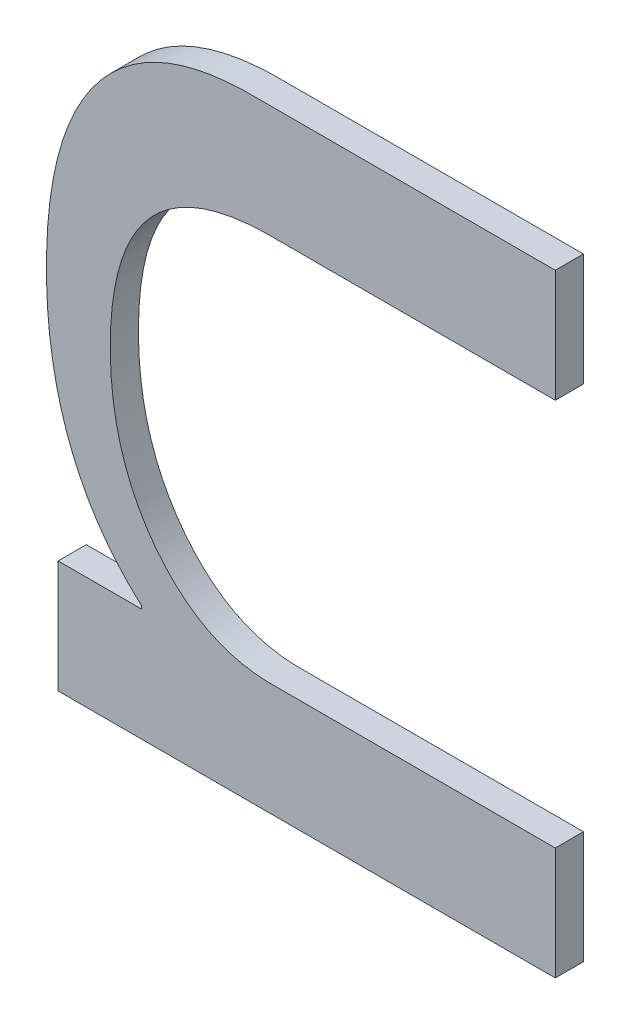
ISO-10303-21;
HEADER;
FILE_DESCRIPTION(('STEP AP214'),'2;1');
FILE_NAME('part.step','',(''),(''),'','','');
FILE_SCHEMA(('AUTOMOTIVE_DESIGN { 1 0 10303 214 1 1 1 1 }'));
ENDSEC;
DATA;
#1=APPLICATION_CONTEXT('core data for automotive mechanical design processes');
#2=APPLICATION_PROTOCOL_DEFINITION('international standard','automotive_design',2000,#1);
#3=PRODUCT_CONTEXT('',#1,'mechanical');
#4=PRODUCT('Part','Part','',(#3));
#5=PRODUCT_RELATED_PRODUCT_CATEGORY('part','',(#4));
#6=PRODUCT_DEFINITION_FORMATION('','',#4);
#7=PRODUCT_DEFINITION_CONTEXT('part definition',#1,'design');
#8=PRODUCT_DEFINITION('design','',#6,#7);
#9=PRODUCT_DEFINITION_SHAPE('','',#8);
#10=(LENGTH_UNIT() NAMED_UNIT(*) SI_UNIT(.MILLI.,.METRE.));
#11=(NAMED_UNIT(*) PLANE_ANGLE_UNIT() SI_UNIT($,.RADIAN.));
#12=(NAMED_UNIT(*) SI_UNIT($,.STERADIAN.) SOLID_ANGLE_UNIT());
#13=UNCERTAINTY_MEASURE_WITH_UNIT(LENGTH_MEASURE(1.E-05),#10,'distance_accuracy_value','');
#14=(GEOMETRIC_REPRESENTATION_CONTEXT(3) GLOBAL_UNCERTAINTY_ASSIGNED_CONTEXT((#13)) GLOBAL_UNIT_ASSIGNED_CONTEXT((#10,
#11,#12)) REPRESENTATION_CONTEXT('',''));
#15=CARTESIAN_POINT('',(0.,0.,0.));
#16=DIRECTION('',(0.,0.,1.));
#17=DIRECTION('',(1.,0.,0.));
#18=AXIS2_PLACEMENT_3D('',#15,#16,#17);
#19=CARTESIAN_POINT('',(-8.95983005625009,-22.7704584365744,333.160489148867));
#20=DIRECTION('',(0.,0.,1.));
#21=DIRECTION('',(1.,0.,0.));
#22=AXIS2_PLACEMENT_3D('',#19,#20,#21);
#23=PLANE('',#22);
#24=CARTESIAN_POINT('',(-6.41452319026449,-47.7542958805043,333.160489148867));
#25=CARTESIAN_POINT('',(-7.42338738324791,-47.7542958805043,333.160489148867));
#26=CARTESIAN_POINT('',(-8.43225157623134,-47.7542958805043,333.160489148867));
#27=CARTESIAN_POINT('',(-10.5840689654579,-47.7542958805043,333.160489148867));
#28=CARTESIAN_POINT('',(-11.1555470427801,-48.3816435735809,333.160489148867));
#29=CARTESIAN_POINT('',(-11.1555459531499,-50.2924195651673,333.160489148867));
#30=CARTESIAN_POINT('',(-10.9919250064618,-50.8311722700616,333.160489148867));
#31=CARTESIAN_POINT('',(-10.3374403582215,-51.6740206585329,333.160489148867));
#32=CARTESIAN_POINT('',(-9.92798836002439,-51.8847327044225,333.160489148867));
#33=CARTESIAN_POINT('',(-8.42905893822012,-51.8847327044225,333.160489148867));
#34=CARTESIAN_POINT('',(-7.4217910642423,-51.8847327044225,333.160489148867));
#35=CARTESIAN_POINT('',(-6.41452319026449,-51.8847327044225,333.160489148867));
#36=(BOUNDED_CURVE() B_SPLINE_CURVE(3,(#24,#25,#26,#27,#28,#29,#30,#31,#32,#33,#34,#35),
.UNSPECIFIED.,.F.,.F.) B_SPLINE_CURVE_WITH_KNOTS((4,2,2,2,2,4),(0.,0.220684096034556,
0.47069950413109,0.601432808643403,0.732166223682619,1.),
.UNSPECIFIED.) CURVE() GEOMETRIC_REPRESENTATION_ITEM() RATIONAL_B_SPLINE_CURVE((1.,1.,1.,1.,1.,
1.,1.,1.,1.,1.,1.,1.)) REPRESENTATION_ITEM(''));
#37=CARTESIAN_POINT('',(-6.41452319026449,-47.7542958805043,333.160489148867));
#38=VERTEX_POINT('',#37);
#39=CARTESIAN_POINT('',(-6.41452319026449,-51.8847327044225,333.160489148867));
#40=VERTEX_POINT('',#39);
#41=EDGE_CURVE('E11',#38,#40,#36,.T.);
#42=ORIENTED_EDGE('',*,*,#41,.T.);
#43=DIRECTION('',(0.,-1.,0.));
#44=VECTOR('',#43,1.);
#45=CARTESIAN_POINT('',(-6.41452319026449,-50.9500000001419,333.160489148867));
#46=LINE('',#45,#44);
#47=CARTESIAN_POINT('',(-6.41452319026449,-53.0843552254562,333.160489148867));
#48=VERTEX_POINT('',#47);
#49=EDGE_CURVE('E159',#40,#48,#46,.T.);
#50=ORIENTED_EDGE('',*,*,#49,.T.);
#51=DIRECTION('',(-1.,0.,0.));
#52=VECTOR('',#51,1.);
#53=CARTESIAN_POINT('',(2.66453525910038E-13,-53.0843552254562,333.160489148867));
#54=LINE('',#53,#52);
#55=CARTESIAN_POINT('',(-11.7110601493991,-53.0843552254562,333.160489148867));
#56=VERTEX_POINT('',#55);
#57=EDGE_CURVE('E153',#48,#56,#54,.T.);
#58=ORIENTED_EDGE('',*,*,#57,.T.);
#59=DIRECTION('',(0.,1.,0.));
#60=VECTOR('',#59,1.);
#61=CARTESIAN_POINT('',(-11.7110601493991,-50.9500000001419,333.160489148867));
#62=LINE('',#61,#60);
#63=CARTESIAN_POINT('',(-11.7110601493991,-51.8847327044225,333.160489148867));
#64=VERTEX_POINT('',#63);
#65=EDGE_CURVE('E114',#56,#64,#62,.T.);
#66=ORIENTED_EDGE('',*,*,#65,.T.);
#67=DIRECTION('',(1.,0.,0.));
#68=VECTOR('',#67,1.);
#69=CARTESIAN_POINT('',(2.66453525910038E-13,-51.8847327044225,333.160489148867));
#70=LINE('',#69,#68);
#71=CARTESIAN_POINT('',(-10.8251113813703,-51.8847327044225,333.160489148867));
#72=VERTEX_POINT('',#71);
#73=EDGE_CURVE('E112',#64,#72,#70,.T.);
#74=ORIENTED_EDGE('',*,*,#73,.T.);
#75=DIRECTION('',(0.,1.,0.));
#76=VECTOR('',#75,1.);
#77=CARTESIAN_POINT('',(-10.8251113813703,-50.9500000001419,333.160489148867));
#78=LINE('',#77,#76);
#79=CARTESIAN_POINT('',(-10.8251113813703,-51.8488158624754,333.160489148867));
#80=VERTEX_POINT('',#79);
#81=EDGE_CURVE('E48',#72,#80,#78,.T.);
#82=ORIENTED_EDGE('',*,*,#81,.T.);
#83=CARTESIAN_POINT('',(-10.8251113813703,-51.8488158624754,333.160489148867));
#84=CARTESIAN_POINT('',(-11.4987515811782,-51.25499092935,333.160489148867));
#85=CARTESIAN_POINT('',(-11.8355718681491,-50.3858033542298,333.160489148867));
#86=CARTESIAN_POINT('',(-11.8355718681491,-48.3696714799986,333.160489148867));
#87=CARTESIAN_POINT('',(-11.6488042900241,-47.7040123017783,333.160489148867));
#88=CARTESIAN_POINT('',(-10.9017339775241,-46.7845411479322,333.160489148867));
#89=CARTESIAN_POINT('',(-10.3605868921876,-46.5546733594706,333.160489148867));
#90=CARTESIAN_POINT('',(-8.57272629967559,-46.5546733594706,333.160489148867));
#91=CARTESIAN_POINT('',(-7.49362474497004,-46.5546733594706,333.160489148867));
#92=CARTESIAN_POINT('',(-6.41452319026449,-46.5546733594706,333.160489148867));
#93=(BOUNDED_CURVE() B_SPLINE_CURVE(3,(#83,#84,#85,#86,#87,#88,#89,#90,#91,#92),.UNSPECIFIED.,
.F.,.F.) B_SPLINE_CURVE_WITH_KNOTS((4,2,2,2,4),(0.,0.271560462679199,0.47835532213715,
0.6851501815951,1.),
.UNSPECIFIED.) CURVE() GEOMETRIC_REPRESENTATION_ITEM() RATIONAL_B_SPLINE_CURVE((1.,1.,1.,1.,1.,
1.,1.,1.,1.,1.)) REPRESENTATION_ITEM(''));
#94=CARTESIAN_POINT('',(-6.41452319026449,-46.5546733594706,333.160489148867));
#95=VERTEX_POINT('',#94);
#96=EDGE_CURVE('E146',#80,#95,#93,.T.);
#97=ORIENTED_EDGE('',*,*,#96,.T.);
#98=DIRECTION('',(0.,-1.,0.));
#99=VECTOR('',#98,1.);
#100=CARTESIAN_POINT('',(-6.41452319026449,-50.9500000001419,333.160489148867));
#101=LINE('',#100,#99);
#102=EDGE_CURVE('E145',#95,#38,#101,.T.);
#103=ORIENTED_EDGE('',*,*,#102,.T.);
#104=EDGE_LOOP('',(#42,#50,#58,#66,#74,#82,#97,#103));
#105=FACE_BOUND('',#104,.T.);
#106=ADVANCED_FACE('F43',(#105),#23,.F.);
#107=CARTESIAN_POINT('',(-6.41452319026449,-47.7542958805043,332.960489148867));
#108=CARTESIAN_POINT('',(-7.42338738324791,-47.7542958805043,332.960489148867));
#109=CARTESIAN_POINT('',(-8.43225157623134,-47.7542958805043,332.960489148867));
#110=CARTESIAN_POINT('',(-10.5840689654579,-47.7542958805043,332.960489148867));
#111=CARTESIAN_POINT('',(-11.1555470427801,-48.3816435735809,332.960489148867));
#112=CARTESIAN_POINT('',(-11.1555459531499,-50.2924195651673,332.960489148867));
#113=CARTESIAN_POINT('',(-10.9919250064618,-50.8311722700616,332.960489148867));
#114=CARTESIAN_POINT('',(-10.3374403582215,-51.6740206585329,332.960489148867));
#115=CARTESIAN_POINT('',(-9.92798836002439,-51.8847327044225,332.960489148867));
#116=CARTESIAN_POINT('',(-8.42905893822012,-51.8847327044225,332.960489148867));
#117=CARTESIAN_POINT('',(-7.4217910642423,-51.8847327044225,332.960489148867));
#118=CARTESIAN_POINT('',(-6.41452319026449,-51.8847327044225,332.960489148867));
#119=(BOUNDED_CURVE() B_SPLINE_CURVE(3,(#107,#108,#109,#110,#111,#112,#113,#114,#115,#116,#117,
#118),.UNSPECIFIED.,.F.,.F.) B_SPLINE_CURVE_WITH_KNOTS((4,2,2,2,2,4),(0.,0.220684096034556,
0.47069950413109,0.601432808643403,0.732166223682619,1.),
.UNSPECIFIED.) CURVE() GEOMETRIC_REPRESENTATION_ITEM() RATIONAL_B_SPLINE_CURVE((1.,1.,1.,1.,1.,
1.,1.,1.,1.,1.,1.,1.)) REPRESENTATION_ITEM(''));
#120=DIRECTION('',(0.,0.,1.));
#121=VECTOR('',#120,1.);
#122=SURFACE_OF_LINEAR_EXTRUSION('',#119,#121);
#123=ORIENTED_EDGE('',*,*,#41,.F.);
#124=CARTESIAN_POINT('',(-6.41452319026449,-47.7542958805043,333.160489148867));
#125=CARTESIAN_POINT('',(-6.41452319026449,-47.7542958805043,333.460489148867));
#126=(BOUNDED_CURVE() B_SPLINE_CURVE(1,(#124,#125),.UNSPECIFIED.,.F.,
.F.) B_SPLINE_CURVE_WITH_KNOTS((2,2),(0.,1.),
.UNSPECIFIED.) CURVE() GEOMETRIC_REPRESENTATION_ITEM() RATIONAL_B_SPLINE_CURVE((1.,1.)) REPRESENTATION_ITEM(''));
#127=CARTESIAN_POINT('',(-6.41452319026449,-47.7542958805043,333.460489148867));
#128=VERTEX_POINT('',#127);
#129=EDGE_CURVE('E219',#38,#128,#126,.T.);
#130=ORIENTED_EDGE('',*,*,#129,.T.);
#131=CARTESIAN_POINT('',(-6.41452319026449,-51.8847327044225,333.460489148867));
#132=CARTESIAN_POINT('',(-7.4217910642423,-51.8847327044225,333.460489148867));
#133=CARTESIAN_POINT('',(-8.42905893822012,-51.8847327044225,333.460489148867));
#134=CARTESIAN_POINT('',(-9.92798836002439,-51.8847327044225,333.460489148867));
#135=CARTESIAN_POINT('',(-10.3374403582215,-51.6740206585329,333.460489148867));
#136=CARTESIAN_POINT('',(-10.9919250064618,-50.8311722700616,333.460489148867));
#137=CARTESIAN_POINT('',(-11.1555459531499,-50.2924195651673,333.460489148867));
#138=CARTESIAN_POINT('',(-11.1555470427801,-48.3816435735809,333.460489148867));
#139=CARTESIAN_POINT('',(-10.5840689654579,-47.7542958805043,333.460489148867));
#140=CARTESIAN_POINT('',(-8.43225157623134,-47.7542958805043,333.460489148867));
#141=CARTESIAN_POINT('',(-7.42338738324791,-47.7542958805043,333.460489148867));
#142=CARTESIAN_POINT('',(-6.41452319026449,-47.7542958805043,333.460489148867));
#143=(BOUNDED_CURVE() B_SPLINE_CURVE(3,(#131,#132,#133,#134,#135,#136,#137,#138,#139,#140,#141,
#142),.UNSPECIFIED.,.F.,.F.) B_SPLINE_CURVE_WITH_KNOTS((4,2,2,2,2,4),(0.,0.267833776317381,
0.398567191356597,0.52930049586891,0.779315903965444,1.),
.UNSPECIFIED.) CURVE() GEOMETRIC_REPRESENTATION_ITEM() RATIONAL_B_SPLINE_CURVE((1.,1.,1.,1.,1.,
1.,1.,1.,1.,1.,1.,1.)) REPRESENTATION_ITEM(''));
#144=CARTESIAN_POINT('',(-6.41452319026449,-51.8847327044225,333.460489148867));
#145=VERTEX_POINT('',#144);
#146=EDGE_CURVE('E134',#145,#128,#143,.T.);
#147=ORIENTED_EDGE('',*,*,#146,.F.);
#148=CARTESIAN_POINT('',(-6.41452319026449,-51.8847327044225,333.160489148867));
#149=CARTESIAN_POINT('',(-6.41452319026449,-51.8847327044225,333.260489148867));
#150=CARTESIAN_POINT('',(-6.41452319026449,-51.8847327044225,333.360489148867));
#151=CARTESIAN_POINT('',(-6.41452319026449,-51.8847327044225,333.460489148867));
#152=(BOUNDED_CURVE() B_SPLINE_CURVE(3,(#148,#149,#150,#151),.UNSPECIFIED.,.F.,
.F.) B_SPLINE_CURVE_WITH_KNOTS((4,4),(0.,1.),
.UNSPECIFIED.) CURVE() GEOMETRIC_REPRESENTATION_ITEM() RATIONAL_B_SPLINE_CURVE((1.,1.,1.,1.)) REPRESENTATION_ITEM(''));
#153=EDGE_CURVE('E54',#40,#145,#152,.T.);
#154=ORIENTED_EDGE('',*,*,#153,.F.);
#155=EDGE_LOOP('',(#123,#130,#147,#154));
#156=FACE_BOUND('',#155,.T.);
#157=ADVANCED_FACE('F45',(#156),#122,.F.);
#158=CARTESIAN_POINT('',(-6.41452319026449,-53.0843552254562,332.960489148867));
#159=DIRECTION('',(1.,0.,0.));
#160=DIRECTION('',(0.,1.,0.));
#161=AXIS2_PLACEMENT_3D('',#158,#159,#160);
#162=PLANE('',#161);
#163=ORIENTED_EDGE('',*,*,#49,.F.);
#164=ORIENTED_EDGE('',*,*,#153,.T.);
#165=CARTESIAN_POINT('',(-6.41452319026449,-53.0843552254562,333.460489148867));
#166=CARTESIAN_POINT('',(-6.41452319026449,-52.6844810517783,333.460489148867));
#167=CARTESIAN_POINT('',(-6.41452319026449,-52.2846068781004,333.460489148867));
#168=CARTESIAN_POINT('',(-6.41452319026449,-51.8847327044225,333.460489148867));
#169=(BOUNDED_CURVE() B_SPLINE_CURVE(3,(#165,#166,#167,#168),.UNSPECIFIED.,.F.,
.F.) B_SPLINE_CURVE_WITH_KNOTS((4,4),(0.,1.),
.UNSPECIFIED.) CURVE() GEOMETRIC_REPRESENTATION_ITEM() RATIONAL_B_SPLINE_CURVE((1.,1.,1.,1.)) REPRESENTATION_ITEM(''));
#170=CARTESIAN_POINT('',(-6.41452319026449,-53.0843552254562,333.460489148867));
#171=VERTEX_POINT('',#170);
#172=EDGE_CURVE('E208',#171,#145,#169,.T.);
#173=ORIENTED_EDGE('',*,*,#172,.F.);
#174=CARTESIAN_POINT('',(-6.41452319026449,-53.0843552254562,333.160489148867));
#175=CARTESIAN_POINT('',(-6.41452319026449,-53.0843552254562,333.260489148867));
#176=CARTESIAN_POINT('',(-6.41452319026449,-53.0843552254562,333.360489148867));
#177=CARTESIAN_POINT('',(-6.41452319026449,-53.0843552254562,333.460489148867));
#178=(BOUNDED_CURVE() B_SPLINE_CURVE(3,(#174,#175,#176,#177),.UNSPECIFIED.,.F.,
.F.) B_SPLINE_CURVE_WITH_KNOTS((4,4),(0.,1.),
.UNSPECIFIED.) CURVE() GEOMETRIC_REPRESENTATION_ITEM() RATIONAL_B_SPLINE_CURVE((1.,1.,1.,1.)) REPRESENTATION_ITEM(''));
#179=EDGE_CURVE('E171',#48,#171,#178,.T.);
#180=ORIENTED_EDGE('',*,*,#179,.F.);
#181=EDGE_LOOP('',(#163,#164,#173,#180));
#182=FACE_BOUND('',#181,.T.);
#183=ADVANCED_FACE('F288',(#182),#162,.T.);
#184=CARTESIAN_POINT('',(-6.41452319026449,-47.7542958805043,332.960489148867));
#185=DIRECTION('',(1.,0.,0.));
#186=DIRECTION('',(0.,1.,0.));
#187=AXIS2_PLACEMENT_3D('',#184,#185,#186);
#188=PLANE('',#187);
#189=ORIENTED_EDGE('',*,*,#102,.F.);
#190=CARTESIAN_POINT('',(-6.41452319026449,-46.5546733594706,333.160489148867));
#191=CARTESIAN_POINT('',(-6.41452319026449,-46.5546733594706,333.260489148867));
#192=CARTESIAN_POINT('',(-6.41452319026449,-46.5546733594706,333.360489148867));
#193=CARTESIAN_POINT('',(-6.41452319026449,-46.5546733594706,333.460489148867));
#194=(BOUNDED_CURVE() B_SPLINE_CURVE(3,(#190,#191,#192,#193),.UNSPECIFIED.,.F.,
.F.) B_SPLINE_CURVE_WITH_KNOTS((4,4),(0.,1.),
.UNSPECIFIED.) CURVE() GEOMETRIC_REPRESENTATION_ITEM() RATIONAL_B_SPLINE_CURVE((1.,1.,1.,1.)) REPRESENTATION_ITEM(''));
#195=CARTESIAN_POINT('',(-6.41452319026449,-46.5546733594706,333.460489148867));
#196=VERTEX_POINT('',#195);
#197=EDGE_CURVE('E138',#95,#196,#194,.T.);
#198=ORIENTED_EDGE('',*,*,#197,.T.);
#199=CARTESIAN_POINT('',(-6.41452319026449,-47.7542958805043,333.460489148867));
#200=CARTESIAN_POINT('',(-6.41452319026449,-47.3544217068264,333.460489148867));
#201=CARTESIAN_POINT('',(-6.41452319026449,-46.9545475331485,333.460489148867));
#202=CARTESIAN_POINT('',(-6.41452319026449,-46.5546733594706,333.460489148867));
#203=(BOUNDED_CURVE() B_SPLINE_CURVE(3,(#199,#200,#201,#202),.UNSPECIFIED.,.F.,
.F.) B_SPLINE_CURVE_WITH_KNOTS((4,4),(0.,1.),
.UNSPECIFIED.) CURVE() GEOMETRIC_REPRESENTATION_ITEM() RATIONAL_B_SPLINE_CURVE((1.,1.,1.,1.)) REPRESENTATION_ITEM(''));
#204=EDGE_CURVE('E184',#128,#196,#203,.T.);
#205=ORIENTED_EDGE('',*,*,#204,.F.);
#206=ORIENTED_EDGE('',*,*,#129,.F.);
#207=EDGE_LOOP('',(#189,#198,#205,#206));
#208=FACE_BOUND('',#207,.T.);
#209=ADVANCED_FACE('F259',(#208),#188,.T.);
#210=CARTESIAN_POINT('',(-10.8251113813703,-51.8488158624754,332.960489148867));
#211=CARTESIAN_POINT('',(-11.4987515811782,-51.25499092935,332.960489148867));
#212=CARTESIAN_POINT('',(-11.8355718681491,-50.3858033542298,332.960489148867));
#213=CARTESIAN_POINT('',(-11.8355718681491,-48.3696714799986,332.960489148867));
#214=CARTESIAN_POINT('',(-11.6488042900241,-47.7040123017783,332.960489148867));
#215=CARTESIAN_POINT('',(-10.9017339775241,-46.7845411479322,332.960489148867));
#216=CARTESIAN_POINT('',(-10.3605868921876,-46.5546733594706,332.960489148867));
#217=CARTESIAN_POINT('',(-8.57272629967559,-46.5546733594706,332.960489148867));
#218=CARTESIAN_POINT('',(-7.49362474497004,-46.5546733594706,332.960489148867));
#219=CARTESIAN_POINT('',(-6.41452319026449,-46.5546733594706,332.960489148867));
#220=(BOUNDED_CURVE() B_SPLINE_CURVE(3,(#210,#211,#212,#213,#214,#215,#216,#217,#218,#219),
.UNSPECIFIED.,.F.,.F.) B_SPLINE_CURVE_WITH_KNOTS((4,2,2,2,4),(0.,0.271560462679199,
0.47835532213715,0.6851501815951,1.),
.UNSPECIFIED.) CURVE() GEOMETRIC_REPRESENTATION_ITEM() RATIONAL_B_SPLINE_CURVE((1.,1.,1.,1.,1.,
1.,1.,1.,1.,1.)) REPRESENTATION_ITEM(''));
#221=DIRECTION('',(0.,0.,1.));
#222=VECTOR('',#221,1.);
#223=SURFACE_OF_LINEAR_EXTRUSION('',#220,#222);
#224=ORIENTED_EDGE('',*,*,#96,.F.);
#225=CARTESIAN_POINT('',(-10.8251113813703,-51.8488158624754,333.160489148867));
#226=CARTESIAN_POINT('',(-10.8251113813703,-51.8488158624754,333.460489148867));
#227=(BOUNDED_CURVE() B_SPLINE_CURVE(1,(#225,#226),.UNSPECIFIED.,.F.,
.F.) B_SPLINE_CURVE_WITH_KNOTS((2,2),(0.,1.),
.UNSPECIFIED.) CURVE() GEOMETRIC_REPRESENTATION_ITEM() RATIONAL_B_SPLINE_CURVE((1.,1.)) REPRESENTATION_ITEM(''));
#228=CARTESIAN_POINT('',(-10.8251113813703,-51.8488158624754,333.460489148867));
#229=VERTEX_POINT('',#228);
#230=EDGE_CURVE('E207',#80,#229,#227,.T.);
#231=ORIENTED_EDGE('',*,*,#230,.T.);
#232=CARTESIAN_POINT('',(-6.41452319026449,-46.5546733594706,333.460489148867));
#233=CARTESIAN_POINT('',(-7.49362474497004,-46.5546733594706,333.460489148867));
#234=CARTESIAN_POINT('',(-8.57272629967559,-46.5546733594706,333.460489148867));
#235=CARTESIAN_POINT('',(-10.3605868921876,-46.5546733594706,333.460489148867));
#236=CARTESIAN_POINT('',(-10.9017339775241,-46.7845411479322,333.460489148867));
#237=CARTESIAN_POINT('',(-11.6488042900241,-47.7040123017783,333.460489148867));
#238=CARTESIAN_POINT('',(-11.8355718681491,-48.3696714799986,333.460489148867));
#239=CARTESIAN_POINT('',(-11.8355718681491,-50.3858033542298,333.460489148867));
#240=CARTESIAN_POINT('',(-11.4987515811782,-51.25499092935,333.460489148867));
#241=CARTESIAN_POINT('',(-10.8251113813703,-51.8488158624754,333.460489148867));
#242=(BOUNDED_CURVE() B_SPLINE_CURVE(3,(#232,#233,#234,#235,#236,#237,#238,#239,#240,#241),
.UNSPECIFIED.,.F.,.F.) B_SPLINE_CURVE_WITH_KNOTS((4,2,2,2,4),(0.,0.3148498184049,
0.52164467786285,0.728439537320801,1.),
.UNSPECIFIED.) CURVE() GEOMETRIC_REPRESENTATION_ITEM() RATIONAL_B_SPLINE_CURVE((1.,1.,1.,1.,1.,
1.,1.,1.,1.,1.)) REPRESENTATION_ITEM(''));
#243=EDGE_CURVE('E128',#196,#229,#242,.T.);
#244=ORIENTED_EDGE('',*,*,#243,.F.);
#245=ORIENTED_EDGE('',*,*,#197,.F.);
#246=EDGE_LOOP('',(#224,#231,#244,#245));
#247=FACE_BOUND('',#246,.T.);
#248=ADVANCED_FACE('F255',(#247),#223,.F.);
#249=CARTESIAN_POINT('',(-10.8251113813703,-51.8488158624754,332.960489148867));
#250=DIRECTION('',(-1.,0.,0.));
#251=DIRECTION('',(0.,0.,1.));
#252=AXIS2_PLACEMENT_3D('',#249,#250,#251);
#253=PLANE('',#252);
#254=ORIENTED_EDGE('',*,*,#81,.F.);
#255=CARTESIAN_POINT('',(-10.8251113813703,-51.8847327044225,333.160489148867));
#256=CARTESIAN_POINT('',(-10.8251113813703,-51.8847327044225,333.260489148867));
#257=CARTESIAN_POINT('',(-10.8251113813703,-51.8847327044225,333.360489148867));
#258=CARTESIAN_POINT('',(-10.8251113813703,-51.8847327044225,333.460489148867));
#259=(BOUNDED_CURVE() B_SPLINE_CURVE(3,(#255,#256,#257,#258),.UNSPECIFIED.,.F.,
.F.) B_SPLINE_CURVE_WITH_KNOTS((4,4),(0.,1.),
.UNSPECIFIED.) CURVE() GEOMETRIC_REPRESENTATION_ITEM() RATIONAL_B_SPLINE_CURVE((1.,1.,1.,1.)) REPRESENTATION_ITEM(''));
#260=CARTESIAN_POINT('',(-10.8251113813703,-51.8847327044225,333.460489148867));
#261=VERTEX_POINT('',#260);
#262=EDGE_CURVE('E221',#72,#261,#259,.T.);
#263=ORIENTED_EDGE('',*,*,#262,.T.);
#264=CARTESIAN_POINT('',(-10.8251113813703,-51.8488158624754,333.460489148867));
#265=CARTESIAN_POINT('',(-10.8251113813703,-51.8607881431245,333.460489148867));
#266=CARTESIAN_POINT('',(-10.8251113813703,-51.8727604237735,333.460489148867));
#267=CARTESIAN_POINT('',(-10.8251113813703,-51.8847327044225,333.460489148867));
#268=(BOUNDED_CURVE() B_SPLINE_CURVE(3,(#264,#265,#266,#267),.UNSPECIFIED.,.F.,
.F.) B_SPLINE_CURVE_WITH_KNOTS((4,4),(0.,1.),
.UNSPECIFIED.) CURVE() GEOMETRIC_REPRESENTATION_ITEM() RATIONAL_B_SPLINE_CURVE((1.,1.,1.,1.)) REPRESENTATION_ITEM(''));
#269=EDGE_CURVE('E126',#229,#261,#268,.T.);
#270=ORIENTED_EDGE('',*,*,#269,.F.);
#271=ORIENTED_EDGE('',*,*,#230,.F.);
#272=EDGE_LOOP('',(#254,#263,#270,#271));
#273=FACE_BOUND('',#272,.T.);
#274=ADVANCED_FACE('F251',(#273),#253,.T.);
#275=CARTESIAN_POINT('',(-10.8251113813703,-51.8847327044225,332.960489148867));
#276=DIRECTION('',(0.,1.,0.));
#277=DIRECTION('',(1.,0.,0.));
#278=AXIS2_PLACEMENT_3D('',#275,#276,#277);
#279=PLANE('',#278);
#280=ORIENTED_EDGE('',*,*,#73,.F.);
#281=CARTESIAN_POINT('',(-11.7110601493991,-51.8847327044225,333.460489148867));
#282=CARTESIAN_POINT('',(-11.7110601493991,-51.8847327044225,333.360489148867));
#283=CARTESIAN_POINT('',(-11.7110601493991,-51.8847327044225,333.260489148867));
#284=CARTESIAN_POINT('',(-11.7110601493991,-51.8847327044225,333.160489148867));
#285=(BOUNDED_CURVE() B_SPLINE_CURVE(3,(#281,#282,#283,#284),.UNSPECIFIED.,.F.,
.F.) B_SPLINE_CURVE_WITH_KNOTS((4,4),(0.,1.),
.UNSPECIFIED.) CURVE() GEOMETRIC_REPRESENTATION_ITEM() RATIONAL_B_SPLINE_CURVE((1.,1.,1.,1.)) REPRESENTATION_ITEM(''));
#286=CARTESIAN_POINT('',(-11.7110601493991,-51.8847327044225,333.460489148867));
#287=VERTEX_POINT('',#286);
#288=EDGE_CURVE('E105',#287,#64,#285,.T.);
#289=ORIENTED_EDGE('',*,*,#288,.F.);
#290=CARTESIAN_POINT('',(-10.8251113813703,-51.8847327044225,333.460489148867));
#291=CARTESIAN_POINT('',(-11.1204276373799,-51.8847327044225,333.460489148867));
#292=CARTESIAN_POINT('',(-11.4157438933895,-51.8847327044225,333.460489148867));
#293=CARTESIAN_POINT('',(-11.7110601493991,-51.8847327044225,333.460489148867));
#294=(BOUNDED_CURVE() B_SPLINE_CURVE(3,(#290,#291,#292,#293),.UNSPECIFIED.,.F.,
.F.) B_SPLINE_CURVE_WITH_KNOTS((4,4),(0.,1.),
.UNSPECIFIED.) CURVE() GEOMETRIC_REPRESENTATION_ITEM() RATIONAL_B_SPLINE_CURVE((1.,1.,1.,1.)) REPRESENTATION_ITEM(''));
#295=EDGE_CURVE('E109',#261,#287,#294,.T.);
#296=ORIENTED_EDGE('',*,*,#295,.F.);
#297=ORIENTED_EDGE('',*,*,#262,.F.);
#298=EDGE_LOOP('',(#280,#289,#296,#297));
#299=FACE_BOUND('',#298,.T.);
#300=ADVANCED_FACE('F106',(#299),#279,.T.);
#301=CARTESIAN_POINT('',(-11.7110601493991,-51.8847327044225,332.960489148867));
#302=DIRECTION('',(-1.,0.,0.));
#303=DIRECTION('',(0.,0.,1.));
#304=AXIS2_PLACEMENT_3D('',#301,#302,#303);
#305=PLANE('',#304);
#306=ORIENTED_EDGE('',*,*,#65,.F.);
#307=CARTESIAN_POINT('',(-11.7110601493991,-53.0843552254562,333.160489148867));
#308=CARTESIAN_POINT('',(-11.7110601493991,-53.0843552254562,333.260489148867));
#309=CARTESIAN_POINT('',(-11.7110601493991,-53.0843552254562,333.360489148867));
#310=CARTESIAN_POINT('',(-11.7110601493991,-53.0843552254562,333.460489148867));
#311=(BOUNDED_CURVE() B_SPLINE_CURVE(3,(#307,#308,#309,#310),.UNSPECIFIED.,.F.,
.F.) B_SPLINE_CURVE_WITH_KNOTS((4,4),(0.,1.),
.UNSPECIFIED.) CURVE() GEOMETRIC_REPRESENTATION_ITEM() RATIONAL_B_SPLINE_CURVE((1.,1.,1.,1.)) REPRESENTATION_ITEM(''));
#312=CARTESIAN_POINT('',(-11.7110601493991,-53.0843552254562,333.460489148867));
#313=VERTEX_POINT('',#312);
#314=EDGE_CURVE('E98',#56,#313,#311,.T.);
#315=ORIENTED_EDGE('',*,*,#314,.T.);
#316=CARTESIAN_POINT('',(-11.7110601493991,-51.8847327044225,333.460489148867));
#317=CARTESIAN_POINT('',(-11.7110601493991,-52.2846068781004,333.460489148867));
#318=CARTESIAN_POINT('',(-11.7110601493991,-52.6844810517783,333.460489148867));
#319=CARTESIAN_POINT('',(-11.7110601493991,-53.0843552254562,333.460489148867));
#320=(BOUNDED_CURVE() B_SPLINE_CURVE(3,(#316,#317,#318,#319),.UNSPECIFIED.,.F.,
.F.) B_SPLINE_CURVE_WITH_KNOTS((4,4),(0.,1.),
.UNSPECIFIED.) CURVE() GEOMETRIC_REPRESENTATION_ITEM() RATIONAL_B_SPLINE_CURVE((1.,1.,1.,1.)) REPRESENTATION_ITEM(''));
#321=EDGE_CURVE('E117',#287,#313,#320,.T.);
#322=ORIENTED_EDGE('',*,*,#321,.F.);
#323=ORIENTED_EDGE('',*,*,#288,.T.);
#324=EDGE_LOOP('',(#306,#315,#322,#323));
#325=FACE_BOUND('',#324,.T.);
#326=ADVANCED_FACE('F118',(#325),#305,.T.);
#327=CARTESIAN_POINT('',(-11.7110601493991,-53.0843552254562,332.960489148867));
#328=DIRECTION('',(0.,-1.,0.));
#329=DIRECTION('',(0.,0.,-1.));
#330=AXIS2_PLACEMENT_3D('',#327,#328,#329);
#331=PLANE('',#330);
#332=ORIENTED_EDGE('',*,*,#57,.F.);
#333=ORIENTED_EDGE('',*,*,#179,.T.);
#334=CARTESIAN_POINT('',(-11.7110601493991,-53.0843552254562,333.460489148867));
#335=CARTESIAN_POINT('',(-9.94554782968757,-53.0843552254562,333.460489148867));
#336=CARTESIAN_POINT('',(-8.18003550997603,-53.0843552254562,333.460489148867));
#337=CARTESIAN_POINT('',(-6.41452319026449,-53.0843552254562,333.460489148867));
#338=(BOUNDED_CURVE() B_SPLINE_CURVE(3,(#334,#335,#336,#337),.UNSPECIFIED.,.F.,
.F.) B_SPLINE_CURVE_WITH_KNOTS((4,4),(0.,1.),
.UNSPECIFIED.) CURVE() GEOMETRIC_REPRESENTATION_ITEM() RATIONAL_B_SPLINE_CURVE((1.,1.,1.,1.)) REPRESENTATION_ITEM(''));
#339=EDGE_CURVE('E121',#313,#171,#338,.T.);
#340=ORIENTED_EDGE('',*,*,#339,.F.);
#341=ORIENTED_EDGE('',*,*,#314,.F.);
#342=EDGE_LOOP('',(#332,#333,#340,#341));
#343=FACE_BOUND('',#342,.T.);
#344=ADVANCED_FACE('F286',(#343),#331,.T.);
#345=CARTESIAN_POINT('',(-11.1308892731607,-50.0597885670083,333.460489148867));
#346=DIRECTION('',(0.,0.,1.));
#347=DIRECTION('',(1.,0.,0.));
#348=AXIS2_PLACEMENT_3D('',#345,#346,#347);
#349=PLANE('',#348);
#350=ORIENTED_EDGE('',*,*,#172,.T.);
#351=ORIENTED_EDGE('',*,*,#146,.T.);
#352=ORIENTED_EDGE('',*,*,#204,.T.);
#353=ORIENTED_EDGE('',*,*,#243,.T.);
#354=ORIENTED_EDGE('',*,*,#269,.T.);
#355=ORIENTED_EDGE('',*,*,#295,.T.);
#356=ORIENTED_EDGE('',*,*,#321,.T.);
#357=ORIENTED_EDGE('',*,*,#339,.T.);
#358=EDGE_LOOP('',(#350,#351,#352,#353,#354,#355,#356,#357));
#359=FACE_BOUND('',#358,.T.);
#360=ADVANCED_FACE('F123',(#359),#349,.T.);
#361=CLOSED_SHELL('',(#106,#157,#183,#209,#248,#274,#300,#326,#344,#360));
#362=MANIFOLD_SOLID_BREP('B2',#361);
#363=ADVANCED_BREP_SHAPE_REPRESENTATION('',(#18,#362),#14);
#364=SHAPE_DEFINITION_REPRESENTATION(#9,#363);
ENDSEC;
END-ISO-10303-21;
